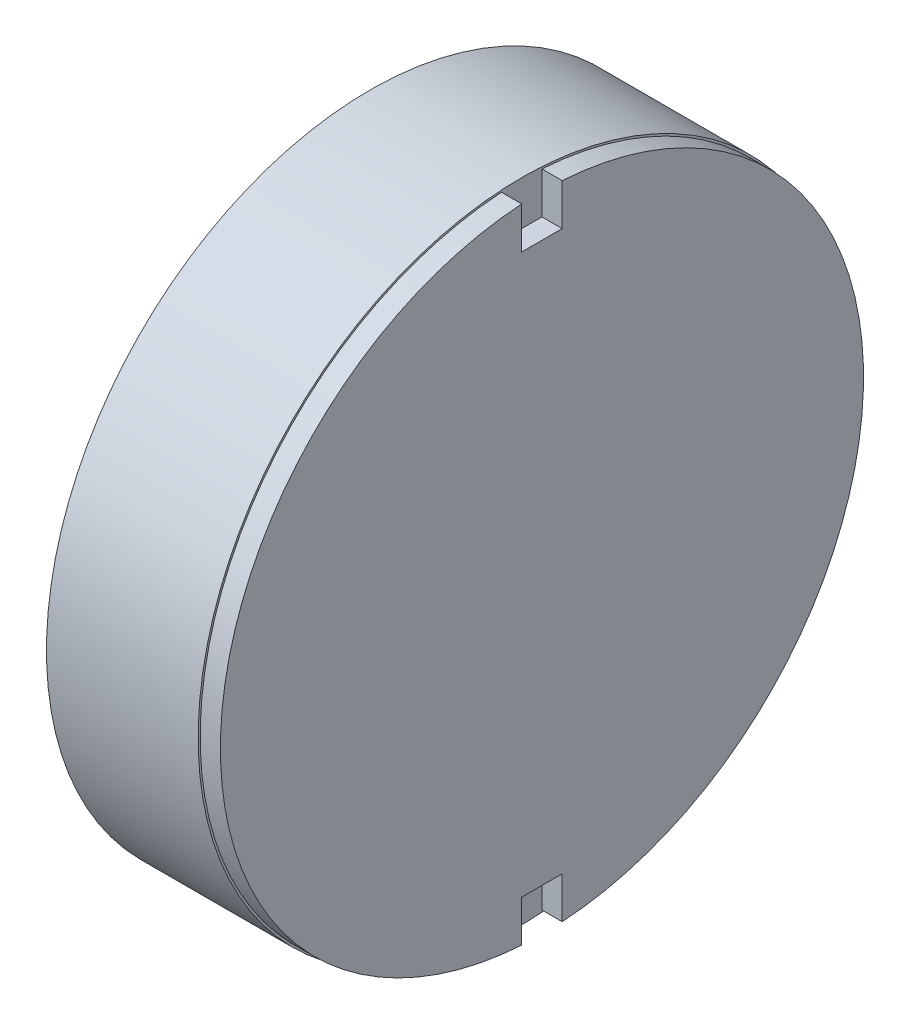
ISO-10303-21;
HEADER;
FILE_DESCRIPTION(('STEP AP214'),'2;1');
FILE_NAME('part.step','',(''),(''),'','','');
FILE_SCHEMA(('AUTOMOTIVE_DESIGN { 1 0 10303 214 1 1 1 1 }'));
ENDSEC;
DATA;
#1=APPLICATION_CONTEXT('core data for automotive mechanical design processes');
#2=APPLICATION_PROTOCOL_DEFINITION('international standard','automotive_design',2000,#1);
#3=PRODUCT_CONTEXT('',#1,'mechanical');
#4=PRODUCT('Part','Part','',(#3));
#5=PRODUCT_RELATED_PRODUCT_CATEGORY('part','',(#4));
#6=PRODUCT_DEFINITION_FORMATION('','',#4);
#7=PRODUCT_DEFINITION_CONTEXT('part definition',#1,'design');
#8=PRODUCT_DEFINITION('design','',#6,#7);
#9=PRODUCT_DEFINITION_SHAPE('','',#8);
#10=(LENGTH_UNIT() NAMED_UNIT(*) SI_UNIT(.MILLI.,.METRE.));
#11=(NAMED_UNIT(*) PLANE_ANGLE_UNIT() SI_UNIT($,.RADIAN.));
#12=(NAMED_UNIT(*) SI_UNIT($,.STERADIAN.) SOLID_ANGLE_UNIT());
#13=UNCERTAINTY_MEASURE_WITH_UNIT(LENGTH_MEASURE(1.E-05),#10,'distance_accuracy_value','');
#14=(GEOMETRIC_REPRESENTATION_CONTEXT(3) GLOBAL_UNCERTAINTY_ASSIGNED_CONTEXT((#13)) GLOBAL_UNIT_ASSIGNED_CONTEXT((#10,
#11,#12)) REPRESENTATION_CONTEXT('',''));
#15=CARTESIAN_POINT('',(0.,0.,0.));
#16=DIRECTION('',(0.,0.,1.));
#17=DIRECTION('',(1.,0.,0.));
#18=AXIS2_PLACEMENT_3D('',#15,#16,#17);
#19=CARTESIAN_POINT('',(8.5,0.,0.));
#20=DIRECTION('',(1.,0.,0.));
#21=DIRECTION('',(0.,0.,-1.));
#22=AXIS2_PLACEMENT_3D('',#19,#20,#21);
#23=CYLINDRICAL_SURFACE('',#22,15.9);
#24=CARTESIAN_POINT('',(8.5,0.,0.));
#25=DIRECTION('',(1.,0.,0.));
#26=DIRECTION('',(0.,0.,-1.));
#27=AXIS2_PLACEMENT_3D('',#24,#25,#26);
#28=CIRCLE('',#27,15.9);
#29=CARTESIAN_POINT('',(8.5,15.8685223004538,0.999999999999999));
#30=VERTEX_POINT('',#29);
#31=CARTESIAN_POINT('',(8.5,-15.8685223004538,0.999999999999999));
#32=VERTEX_POINT('',#31);
#33=EDGE_CURVE('E164',#30,#32,#28,.T.);
#34=ORIENTED_EDGE('',*,*,#33,.F.);
#35=DIRECTION('',(1.,0.,0.));
#36=VECTOR('',#35,1.);
#37=CARTESIAN_POINT('',(8.5,15.8685223004538,0.999999999999999));
#38=LINE('',#37,#36);
#39=CARTESIAN_POINT('',(7.5,15.8685223004538,0.999999999999999));
#40=VERTEX_POINT('',#39);
#41=EDGE_CURVE('E153',#30,#40,#38,.F.);
#42=ORIENTED_EDGE('',*,*,#41,.T.);
#43=CARTESIAN_POINT('',(7.5,0.,0.));
#44=DIRECTION('',(1.,0.,0.));
#45=DIRECTION('',(0.,0.,-1.));
#46=AXIS2_PLACEMENT_3D('',#43,#44,#45);
#47=CIRCLE('',#46,15.9);
#48=CARTESIAN_POINT('',(7.5,-15.8685223004538,0.999999999999999));
#49=VERTEX_POINT('',#48);
#50=EDGE_CURVE('E110',#40,#49,#47,.T.);
#51=ORIENTED_EDGE('',*,*,#50,.T.);
#52=DIRECTION('',(1.,0.,0.));
#53=VECTOR('',#52,1.);
#54=CARTESIAN_POINT('',(8.5,-15.8685223004538,0.999999999999999));
#55=LINE('',#54,#53);
#56=EDGE_CURVE('E147',#49,#32,#55,.T.);
#57=ORIENTED_EDGE('',*,*,#56,.T.);
#58=EDGE_LOOP('',(#34,#42,#51,#57));
#59=FACE_BOUND('',#58,.T.);
#60=ADVANCED_FACE('F37',(#59),#23,.T.);
#61=CARTESIAN_POINT('',(8.5,0.,0.));
#62=DIRECTION('',(-1.,0.,0.));
#63=DIRECTION('',(0.,0.,1.));
#64=AXIS2_PLACEMENT_3D('',#61,#62,#63);
#65=CYLINDRICAL_SURFACE('',#64,16.);
#66=CARTESIAN_POINT('',(7.5,0.,0.));
#67=DIRECTION('',(1.,0.,0.));
#68=DIRECTION('',(0.,0.,-1.));
#69=AXIS2_PLACEMENT_3D('',#66,#67,#68);
#70=CIRCLE('',#69,16.);
#71=CARTESIAN_POINT('',(7.5,0.,-16.));
#72=VERTEX_POINT('',#71);
#73=EDGE_CURVE('E155',#72,#72,#70,.T.);
#74=ORIENTED_EDGE('',*,*,#73,.F.);
#75=EDGE_LOOP('',(#74));
#76=FACE_BOUND('',#75,.T.);
#77=CARTESIAN_POINT('',(0.,0.,0.));
#78=DIRECTION('',(1.,0.,0.));
#79=DIRECTION('',(0.,0.,-1.));
#80=AXIS2_PLACEMENT_3D('',#77,#78,#79);
#81=CIRCLE('',#80,16.);
#82=CARTESIAN_POINT('',(0.,0.,-16.));
#83=VERTEX_POINT('',#82);
#84=EDGE_CURVE('E165',#83,#83,#81,.T.);
#85=ORIENTED_EDGE('',*,*,#84,.T.);
#86=EDGE_LOOP('',(#85));
#87=FACE_BOUND('',#86,.T.);
#88=ADVANCED_FACE('F39',(#76,#87),#65,.T.);
#89=CARTESIAN_POINT('',(0.,0.,0.));
#90=DIRECTION('',(1.,0.,0.));
#91=DIRECTION('',(0.,0.,-1.));
#92=AXIS2_PLACEMENT_3D('',#89,#90,#91);
#93=PLANE('',#92);
#94=ORIENTED_EDGE('',*,*,#84,.F.);
#95=EDGE_LOOP('',(#94));
#96=FACE_BOUND('',#95,.T.);
#97=ADVANCED_FACE('F190',(#96),#93,.F.);
#98=CARTESIAN_POINT('',(7.5,-15.8685223004538,-1.));
#99=VERTEX_POINT('',#98);
#100=CARTESIAN_POINT('',(7.5,15.8685223004538,-1.));
#101=VERTEX_POINT('',#100);
#102=EDGE_CURVE('E158',#99,#101,#47,.T.);
#103=ORIENTED_EDGE('',*,*,#102,.T.);
#104=DIRECTION('',(1.,0.,0.));
#105=VECTOR('',#104,1.);
#106=CARTESIAN_POINT('',(8.5,15.8685223004538,-1.));
#107=LINE('',#106,#105);
#108=CARTESIAN_POINT('',(8.5,15.8685223004538,-1.));
#109=VERTEX_POINT('',#108);
#110=EDGE_CURVE('E150',#101,#109,#107,.T.);
#111=ORIENTED_EDGE('',*,*,#110,.T.);
#112=CARTESIAN_POINT('',(8.5,-15.8685223004538,-1.));
#113=VERTEX_POINT('',#112);
#114=EDGE_CURVE('E161',#113,#109,#28,.T.);
#115=ORIENTED_EDGE('',*,*,#114,.F.);
#116=DIRECTION('',(1.,0.,0.));
#117=VECTOR('',#116,1.);
#118=CARTESIAN_POINT('',(8.5,-15.8685223004538,-1.));
#119=LINE('',#118,#117);
#120=EDGE_CURVE('E60',#113,#99,#119,.F.);
#121=ORIENTED_EDGE('',*,*,#120,.T.);
#122=EDGE_LOOP('',(#103,#111,#115,#121));
#123=FACE_BOUND('',#122,.T.);
#124=ADVANCED_FACE('F187',(#123),#23,.T.);
#125=CARTESIAN_POINT('',(7.5,16.,0.));
#126=DIRECTION('',(-1.,0.,0.));
#127=DIRECTION('',(0.,0.,1.));
#128=AXIS2_PLACEMENT_3D('',#125,#126,#127);
#129=PLANE('',#128);
#130=ORIENTED_EDGE('',*,*,#73,.T.);
#131=EDGE_LOOP('',(#130));
#132=FACE_BOUND('',#131,.T.);
#133=ORIENTED_EDGE('',*,*,#50,.F.);
#134=DIRECTION('',(0.,-1.,0.));
#135=VECTOR('',#134,1.);
#136=CARTESIAN_POINT('',(7.5,15.8141432891742,0.999999999999999));
#137=LINE('',#136,#135);
#138=CARTESIAN_POINT('',(7.5,13.8141432891742,0.999999999999999));
#139=VERTEX_POINT('',#138);
#140=EDGE_CURVE('E102',#40,#139,#137,.T.);
#141=ORIENTED_EDGE('',*,*,#140,.T.);
#142=DIRECTION('',(0.,0.,-1.));
#143=VECTOR('',#142,1.);
#144=CARTESIAN_POINT('',(7.5,13.8141432891742,0.999999999999999));
#145=LINE('',#144,#143);
#146=CARTESIAN_POINT('',(7.5,13.8141432891742,-1.));
#147=VERTEX_POINT('',#146);
#148=EDGE_CURVE('E107',#139,#147,#145,.T.);
#149=ORIENTED_EDGE('',*,*,#148,.T.);
#150=DIRECTION('',(0.,1.,0.));
#151=VECTOR('',#150,1.);
#152=CARTESIAN_POINT('',(7.5,15.8141432891742,-1.));
#153=LINE('',#152,#151);
#154=EDGE_CURVE('E113',#147,#101,#153,.T.);
#155=ORIENTED_EDGE('',*,*,#154,.T.);
#156=ORIENTED_EDGE('',*,*,#102,.F.);
#157=DIRECTION('',(0.,1.,0.));
#158=VECTOR('',#157,1.);
#159=CARTESIAN_POINT('',(7.5,-17.8141432891742,-1.));
#160=LINE('',#159,#158);
#161=CARTESIAN_POINT('',(7.5,-13.8141432891742,-1.));
#162=VERTEX_POINT('',#161);
#163=EDGE_CURVE('E130',#99,#162,#160,.T.);
#164=ORIENTED_EDGE('',*,*,#163,.T.);
#165=DIRECTION('',(0.,0.,1.));
#166=VECTOR('',#165,1.);
#167=CARTESIAN_POINT('',(7.5,-13.8141432891742,0.999999999999999));
#168=LINE('',#167,#166);
#169=CARTESIAN_POINT('',(7.5,-13.8141432891742,0.999999999999999));
#170=VERTEX_POINT('',#169);
#171=EDGE_CURVE('E132',#162,#170,#168,.T.);
#172=ORIENTED_EDGE('',*,*,#171,.T.);
#173=DIRECTION('',(0.,-1.,0.));
#174=VECTOR('',#173,1.);
#175=CARTESIAN_POINT('',(7.5,-15.8141432891742,0.999999999999999));
#176=LINE('',#175,#174);
#177=EDGE_CURVE('E136',#170,#49,#176,.T.);
#178=ORIENTED_EDGE('',*,*,#177,.T.);
#179=EDGE_LOOP('',(#133,#141,#149,#155,#156,#164,#172,#178));
#180=FACE_BOUND('',#179,.T.);
#181=ADVANCED_FACE('F104',(#132,#180),#129,.F.);
#182=CARTESIAN_POINT('',(8.5,0.,0.));
#183=DIRECTION('',(1.,0.,0.));
#184=DIRECTION('',(0.,0.,-1.));
#185=AXIS2_PLACEMENT_3D('',#182,#183,#184);
#186=PLANE('',#185);
#187=DIRECTION('',(0.,-1.,0.));
#188=VECTOR('',#187,1.);
#189=CARTESIAN_POINT('',(8.5,0.,0.999999999999996));
#190=LINE('',#189,#188);
#191=CARTESIAN_POINT('',(8.5,13.8141432891742,0.999999999999999));
#192=VERTEX_POINT('',#191);
#193=EDGE_CURVE('E11',#30,#192,#190,.T.);
#194=ORIENTED_EDGE('',*,*,#193,.F.);
#195=ORIENTED_EDGE('',*,*,#33,.T.);
#196=DIRECTION('',(0.,-1.,0.));
#197=VECTOR('',#196,1.);
#198=CARTESIAN_POINT('',(8.5,-15.8141432891742,0.999999999999999));
#199=LINE('',#198,#197);
#200=CARTESIAN_POINT('',(8.5,-13.8141432891742,0.999999999999999));
#201=VERTEX_POINT('',#200);
#202=EDGE_CURVE('E133',#201,#32,#199,.T.);
#203=ORIENTED_EDGE('',*,*,#202,.F.);
#204=DIRECTION('',(0.,0.,1.));
#205=VECTOR('',#204,1.);
#206=CARTESIAN_POINT('',(8.5,-13.8141432891742,0.999999999999999));
#207=LINE('',#206,#205);
#208=CARTESIAN_POINT('',(8.5,-13.8141432891742,-1.));
#209=VERTEX_POINT('',#208);
#210=EDGE_CURVE('E139',#209,#201,#207,.T.);
#211=ORIENTED_EDGE('',*,*,#210,.F.);
#212=DIRECTION('',(0.,1.,0.));
#213=VECTOR('',#212,1.);
#214=CARTESIAN_POINT('',(8.5,0.,-1.00000000000001));
#215=LINE('',#214,#213);
#216=EDGE_CURVE('E45',#113,#209,#215,.T.);
#217=ORIENTED_EDGE('',*,*,#216,.F.);
#218=ORIENTED_EDGE('',*,*,#114,.T.);
#219=DIRECTION('',(0.,1.,0.));
#220=VECTOR('',#219,1.);
#221=CARTESIAN_POINT('',(8.5,17.8141432891742,-1.));
#222=LINE('',#221,#220);
#223=CARTESIAN_POINT('',(8.5,13.8141432891742,-1.));
#224=VERTEX_POINT('',#223);
#225=EDGE_CURVE('E125',#224,#109,#222,.T.);
#226=ORIENTED_EDGE('',*,*,#225,.F.);
#227=DIRECTION('',(0.,0.,-1.));
#228=VECTOR('',#227,1.);
#229=CARTESIAN_POINT('',(8.5,13.8141432891742,0.999999999999999));
#230=LINE('',#229,#228);
#231=EDGE_CURVE('E52',#192,#224,#230,.T.);
#232=ORIENTED_EDGE('',*,*,#231,.F.);
#233=EDGE_LOOP('',(#194,#195,#203,#211,#217,#218,#226,#232));
#234=FACE_BOUND('',#233,.T.);
#235=ADVANCED_FACE('F176',(#234),#186,.T.);
#236=CARTESIAN_POINT('',(7.5,-15.8141432891742,0.999999999999999));
#237=DIRECTION('',(0.,0.,1.));
#238=DIRECTION('',(1.,0.,0.));
#239=AXIS2_PLACEMENT_3D('',#236,#237,#238);
#240=PLANE('',#239);
#241=ORIENTED_EDGE('',*,*,#177,.F.);
#242=DIRECTION('',(1.,0.,0.));
#243=VECTOR('',#242,1.);
#244=CARTESIAN_POINT('',(7.5,-13.8141432891742,0.999999999999999));
#245=LINE('',#244,#243);
#246=EDGE_CURVE('E127',#170,#201,#245,.T.);
#247=ORIENTED_EDGE('',*,*,#246,.T.);
#248=ORIENTED_EDGE('',*,*,#202,.T.);
#249=ORIENTED_EDGE('',*,*,#56,.F.);
#250=EDGE_LOOP('',(#241,#247,#248,#249));
#251=FACE_BOUND('',#250,.T.);
#252=ADVANCED_FACE('F181',(#251),#240,.F.);
#253=CARTESIAN_POINT('',(7.5,-15.8141432891742,-1.));
#254=DIRECTION('',(0.,0.,-1.));
#255=DIRECTION('',(0.,1.,0.));
#256=AXIS2_PLACEMENT_3D('',#253,#254,#255);
#257=PLANE('',#256);
#258=ORIENTED_EDGE('',*,*,#216,.T.);
#259=DIRECTION('',(1.,0.,0.));
#260=VECTOR('',#259,1.);
#261=CARTESIAN_POINT('',(7.5,-13.8141432891742,-1.));
#262=LINE('',#261,#260);
#263=EDGE_CURVE('E138',#162,#209,#262,.T.);
#264=ORIENTED_EDGE('',*,*,#263,.F.);
#265=ORIENTED_EDGE('',*,*,#163,.F.);
#266=ORIENTED_EDGE('',*,*,#120,.F.);
#267=EDGE_LOOP('',(#258,#264,#265,#266));
#268=FACE_BOUND('',#267,.T.);
#269=ADVANCED_FACE('F168',(#268),#257,.F.);
#270=CARTESIAN_POINT('',(7.5,-13.8141432891742,0.999999999999999));
#271=DIRECTION('',(0.,1.,0.));
#272=DIRECTION('',(0.,0.,1.));
#273=AXIS2_PLACEMENT_3D('',#270,#271,#272);
#274=PLANE('',#273);
#275=ORIENTED_EDGE('',*,*,#210,.T.);
#276=ORIENTED_EDGE('',*,*,#246,.F.);
#277=ORIENTED_EDGE('',*,*,#171,.F.);
#278=ORIENTED_EDGE('',*,*,#263,.T.);
#279=EDGE_LOOP('',(#275,#276,#277,#278));
#280=FACE_BOUND('',#279,.T.);
#281=ADVANCED_FACE('F174',(#280),#274,.F.);
#282=CARTESIAN_POINT('',(7.5,15.8141432891742,0.999999999999999));
#283=DIRECTION('',(0.,0.,1.));
#284=DIRECTION('',(0.,-1.,0.));
#285=AXIS2_PLACEMENT_3D('',#282,#283,#284);
#286=PLANE('',#285);
#287=ORIENTED_EDGE('',*,*,#193,.T.);
#288=DIRECTION('',(1.,0.,0.));
#289=VECTOR('',#288,1.);
#290=CARTESIAN_POINT('',(7.5,13.8141432891742,0.999999999999999));
#291=LINE('',#290,#289);
#292=EDGE_CURVE('E115',#139,#192,#291,.T.);
#293=ORIENTED_EDGE('',*,*,#292,.F.);
#294=ORIENTED_EDGE('',*,*,#140,.F.);
#295=ORIENTED_EDGE('',*,*,#41,.F.);
#296=EDGE_LOOP('',(#287,#293,#294,#295));
#297=FACE_BOUND('',#296,.T.);
#298=ADVANCED_FACE('F116',(#297),#286,.F.);
#299=CARTESIAN_POINT('',(7.5,17.8141432891742,-1.));
#300=DIRECTION('',(0.,0.,-1.));
#301=DIRECTION('',(0.,1.,0.));
#302=AXIS2_PLACEMENT_3D('',#299,#300,#301);
#303=PLANE('',#302);
#304=ORIENTED_EDGE('',*,*,#154,.F.);
#305=DIRECTION('',(1.,0.,0.));
#306=VECTOR('',#305,1.);
#307=CARTESIAN_POINT('',(7.5,13.8141432891742,-1.));
#308=LINE('',#307,#306);
#309=EDGE_CURVE('E118',#147,#224,#308,.T.);
#310=ORIENTED_EDGE('',*,*,#309,.T.);
#311=ORIENTED_EDGE('',*,*,#225,.T.);
#312=ORIENTED_EDGE('',*,*,#110,.F.);
#313=EDGE_LOOP('',(#304,#310,#311,#312));
#314=FACE_BOUND('',#313,.T.);
#315=ADVANCED_FACE('F185',(#314),#303,.F.);
#316=CARTESIAN_POINT('',(7.5,13.8141432891742,0.999999999999999));
#317=DIRECTION('',(0.,-1.,0.));
#318=DIRECTION('',(0.,0.,-1.));
#319=AXIS2_PLACEMENT_3D('',#316,#317,#318);
#320=PLANE('',#319);
#321=ORIENTED_EDGE('',*,*,#231,.T.);
#322=ORIENTED_EDGE('',*,*,#309,.F.);
#323=ORIENTED_EDGE('',*,*,#148,.F.);
#324=ORIENTED_EDGE('',*,*,#292,.T.);
#325=EDGE_LOOP('',(#321,#322,#323,#324));
#326=FACE_BOUND('',#325,.T.);
#327=ADVANCED_FACE('F120',(#326),#320,.F.);
#328=CLOSED_SHELL('',(#60,#88,#97,#124,#181,#235,#252,#269,#281,#298,#315,#327));
#329=MANIFOLD_SOLID_BREP('B2',#328);
#330=ADVANCED_BREP_SHAPE_REPRESENTATION('',(#18,#329),#14);
#331=SHAPE_DEFINITION_REPRESENTATION(#9,#330);
ENDSEC;
END-ISO-10303-21;
